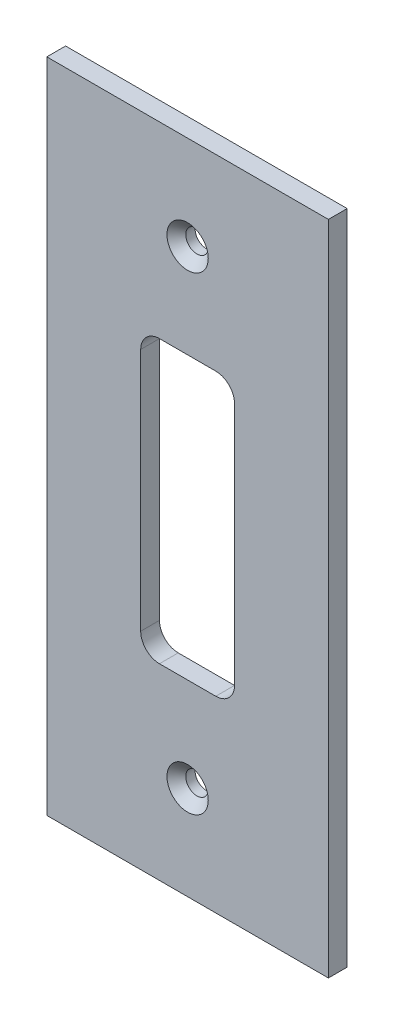
ISO-10303-21;
HEADER;
FILE_DESCRIPTION(('STEP AP214'),'2;1');
FILE_NAME('part.step','',(''),(''),'','','');
FILE_SCHEMA(('AUTOMOTIVE_DESIGN { 1 0 10303 214 1 1 1 1 }'));
ENDSEC;
DATA;
#1=APPLICATION_CONTEXT('core data for automotive mechanical design processes');
#2=APPLICATION_PROTOCOL_DEFINITION('international standard','automotive_design',2000,#1);
#3=PRODUCT_CONTEXT('',#1,'mechanical');
#4=PRODUCT('Part','Part','',(#3));
#5=PRODUCT_RELATED_PRODUCT_CATEGORY('part','',(#4));
#6=PRODUCT_DEFINITION_FORMATION('','',#4);
#7=PRODUCT_DEFINITION_CONTEXT('part definition',#1,'design');
#8=PRODUCT_DEFINITION('design','',#6,#7);
#9=PRODUCT_DEFINITION_SHAPE('','',#8);
#10=(LENGTH_UNIT() NAMED_UNIT(*) SI_UNIT(.MILLI.,.METRE.));
#11=(NAMED_UNIT(*) PLANE_ANGLE_UNIT() SI_UNIT($,.RADIAN.));
#12=(NAMED_UNIT(*) SI_UNIT($,.STERADIAN.) SOLID_ANGLE_UNIT());
#13=UNCERTAINTY_MEASURE_WITH_UNIT(LENGTH_MEASURE(1.E-05),#10,'distance_accuracy_value','');
#14=(GEOMETRIC_REPRESENTATION_CONTEXT(3) GLOBAL_UNCERTAINTY_ASSIGNED_CONTEXT((#13)) GLOBAL_UNIT_ASSIGNED_CONTEXT((#10,
#11,#12)) REPRESENTATION_CONTEXT('',''));
#15=CARTESIAN_POINT('',(0.,0.,0.));
#16=DIRECTION('',(0.,0.,1.));
#17=DIRECTION('',(1.,0.,0.));
#18=AXIS2_PLACEMENT_3D('',#15,#16,#17);
#19=CARTESIAN_POINT('',(0.,0.,-2.));
#20=DIRECTION('',(-1.,0.,0.));
#21=DIRECTION('',(0.,0.,1.));
#22=AXIS2_PLACEMENT_3D('',#19,#20,#21);
#23=PLANE('',#22);
#24=DIRECTION('',(0.,-1.,0.));
#25=VECTOR('',#24,1.);
#26=CARTESIAN_POINT('',(0.,0.,0.));
#27=LINE('',#26,#25);
#28=CARTESIAN_POINT('',(0.,70.,0.));
#29=VERTEX_POINT('',#28);
#30=CARTESIAN_POINT('',(0.,0.,0.));
#31=VERTEX_POINT('',#30);
#32=EDGE_CURVE('E187',#29,#31,#27,.T.);
#33=ORIENTED_EDGE('',*,*,#32,.F.);
#34=DIRECTION('',(0.,0.,1.));
#35=VECTOR('',#34,1.);
#36=CARTESIAN_POINT('',(0.,70.,-2.));
#37=LINE('',#36,#35);
#38=CARTESIAN_POINT('',(0.,70.,-2.));
#39=VERTEX_POINT('',#38);
#40=EDGE_CURVE('E11',#39,#29,#37,.T.);
#41=ORIENTED_EDGE('',*,*,#40,.F.);
#42=DIRECTION('',(0.,-1.,0.));
#43=VECTOR('',#42,1.);
#44=CARTESIAN_POINT('',(0.,0.,-2.));
#45=LINE('',#44,#43);
#46=CARTESIAN_POINT('',(0.,0.,-2.));
#47=VERTEX_POINT('',#46);
#48=EDGE_CURVE('E199',#39,#47,#45,.T.);
#49=ORIENTED_EDGE('',*,*,#48,.T.);
#50=DIRECTION('',(0.,0.,1.));
#51=VECTOR('',#50,1.);
#52=CARTESIAN_POINT('',(0.,0.,-2.));
#53=LINE('',#52,#51);
#54=EDGE_CURVE('E41',#47,#31,#53,.T.);
#55=ORIENTED_EDGE('',*,*,#54,.T.);
#56=EDGE_LOOP('',(#33,#41,#49,#55));
#57=FACE_BOUND('',#56,.T.);
#58=ADVANCED_FACE('F38',(#57),#23,.T.);
#59=CARTESIAN_POINT('',(0.,70.,-2.));
#60=DIRECTION('',(0.,1.,0.));
#61=DIRECTION('',(0.,0.,1.));
#62=AXIS2_PLACEMENT_3D('',#59,#60,#61);
#63=PLANE('',#62);
#64=DIRECTION('',(-1.,0.,0.));
#65=VECTOR('',#64,1.);
#66=CARTESIAN_POINT('',(0.,70.,0.));
#67=LINE('',#66,#65);
#68=CARTESIAN_POINT('',(30.,70.,0.));
#69=VERTEX_POINT('',#68);
#70=EDGE_CURVE('E203',#69,#29,#67,.T.);
#71=ORIENTED_EDGE('',*,*,#70,.F.);
#72=DIRECTION('',(0.,0.,1.));
#73=VECTOR('',#72,1.);
#74=CARTESIAN_POINT('',(30.,70.,-2.));
#75=LINE('',#74,#73);
#76=CARTESIAN_POINT('',(30.,70.,-2.));
#77=VERTEX_POINT('',#76);
#78=EDGE_CURVE('E46',#77,#69,#75,.T.);
#79=ORIENTED_EDGE('',*,*,#78,.F.);
#80=DIRECTION('',(-1.,0.,0.));
#81=VECTOR('',#80,1.);
#82=CARTESIAN_POINT('',(0.,70.,-2.));
#83=LINE('',#82,#81);
#84=EDGE_CURVE('E209',#77,#39,#83,.T.);
#85=ORIENTED_EDGE('',*,*,#84,.T.);
#86=ORIENTED_EDGE('',*,*,#40,.T.);
#87=EDGE_LOOP('',(#71,#79,#85,#86));
#88=FACE_BOUND('',#87,.T.);
#89=ADVANCED_FACE('F235',(#88),#63,.T.);
#90=CARTESIAN_POINT('',(30.,0.,-2.));
#91=DIRECTION('',(1.,0.,0.));
#92=DIRECTION('',(0.,0.,-1.));
#93=AXIS2_PLACEMENT_3D('',#90,#91,#92);
#94=PLANE('',#93);
#95=DIRECTION('',(0.,1.,0.));
#96=VECTOR('',#95,1.);
#97=CARTESIAN_POINT('',(30.,0.,0.));
#98=LINE('',#97,#96);
#99=CARTESIAN_POINT('',(30.,0.,0.));
#100=VERTEX_POINT('',#99);
#101=EDGE_CURVE('E217',#100,#69,#98,.T.);
#102=ORIENTED_EDGE('',*,*,#101,.F.);
#103=DIRECTION('',(0.,0.,1.));
#104=VECTOR('',#103,1.);
#105=CARTESIAN_POINT('',(30.,0.,-2.));
#106=LINE('',#105,#104);
#107=CARTESIAN_POINT('',(30.,0.,-2.));
#108=VERTEX_POINT('',#107);
#109=EDGE_CURVE('E222',#108,#100,#106,.T.);
#110=ORIENTED_EDGE('',*,*,#109,.F.);
#111=DIRECTION('',(0.,1.,0.));
#112=VECTOR('',#111,1.);
#113=CARTESIAN_POINT('',(30.,0.,-2.));
#114=LINE('',#113,#112);
#115=EDGE_CURVE('E206',#108,#77,#114,.T.);
#116=ORIENTED_EDGE('',*,*,#115,.T.);
#117=ORIENTED_EDGE('',*,*,#78,.T.);
#118=EDGE_LOOP('',(#102,#110,#116,#117));
#119=FACE_BOUND('',#118,.T.);
#120=ADVANCED_FACE('F239',(#119),#94,.T.);
#121=CARTESIAN_POINT('',(0.,0.,-2.));
#122=DIRECTION('',(0.,-1.,0.));
#123=DIRECTION('',(0.,0.,-1.));
#124=AXIS2_PLACEMENT_3D('',#121,#122,#123);
#125=PLANE('',#124);
#126=DIRECTION('',(1.,0.,0.));
#127=VECTOR('',#126,1.);
#128=CARTESIAN_POINT('',(0.,0.,0.));
#129=LINE('',#128,#127);
#130=EDGE_CURVE('E214',#31,#100,#129,.T.);
#131=ORIENTED_EDGE('',*,*,#130,.F.);
#132=ORIENTED_EDGE('',*,*,#54,.F.);
#133=DIRECTION('',(1.,0.,0.));
#134=VECTOR('',#133,1.);
#135=CARTESIAN_POINT('',(0.,0.,-2.));
#136=LINE('',#135,#134);
#137=EDGE_CURVE('E202',#47,#108,#136,.T.);
#138=ORIENTED_EDGE('',*,*,#137,.T.);
#139=ORIENTED_EDGE('',*,*,#109,.T.);
#140=EDGE_LOOP('',(#131,#132,#138,#139));
#141=FACE_BOUND('',#140,.T.);
#142=ADVANCED_FACE('F230',(#141),#125,.T.);
#143=CARTESIAN_POINT('',(0.,70.,-2.));
#144=DIRECTION('',(0.,0.,-1.));
#145=DIRECTION('',(-1.,0.,0.));
#146=AXIS2_PLACEMENT_3D('',#143,#144,#145);
#147=PLANE('',#146);
#148=CARTESIAN_POINT('',(15.,60.,-2.));
#149=DIRECTION('',(0.,0.,1.));
#150=DIRECTION('',(1.,0.,0.));
#151=AXIS2_PLACEMENT_3D('',#148,#149,#150);
#152=CIRCLE('',#151,1.2);
#153=CARTESIAN_POINT('',(16.2,60.,-2.));
#154=VERTEX_POINT('',#153);
#155=EDGE_CURVE('E409',#154,#154,#152,.T.);
#156=ORIENTED_EDGE('',*,*,#155,.T.);
#157=EDGE_LOOP('',(#156));
#158=FACE_BOUND('',#157,.T.);
#159=CARTESIAN_POINT('',(15.,10.,-2.));
#160=DIRECTION('',(0.,0.,1.));
#161=DIRECTION('',(1.,0.,0.));
#162=AXIS2_PLACEMENT_3D('',#159,#160,#161);
#163=CIRCLE('',#162,1.2);
#164=CARTESIAN_POINT('',(16.2,10.,-2.));
#165=VERTEX_POINT('',#164);
#166=EDGE_CURVE('E152',#165,#165,#163,.T.);
#167=ORIENTED_EDGE('',*,*,#166,.T.);
#168=EDGE_LOOP('',(#167));
#169=FACE_BOUND('',#168,.T.);
#170=CARTESIAN_POINT('',(12.,48.,-2.));
#171=DIRECTION('',(0.,0.,1.));
#172=DIRECTION('',(1.,0.,0.));
#173=AXIS2_PLACEMENT_3D('',#170,#171,#172);
#174=CIRCLE('',#173,2.);
#175=CARTESIAN_POINT('',(12.,50.,-2.));
#176=VERTEX_POINT('',#175);
#177=CARTESIAN_POINT('',(10.,48.,-2.));
#178=VERTEX_POINT('',#177);
#179=EDGE_CURVE('E129',#176,#178,#174,.T.);
#180=ORIENTED_EDGE('',*,*,#179,.T.);
#181=DIRECTION('',(0.,-1.,0.));
#182=VECTOR('',#181,1.);
#183=CARTESIAN_POINT('',(10.,48.,-2.));
#184=LINE('',#183,#182);
#185=CARTESIAN_POINT('',(10.,22.,-2.));
#186=VERTEX_POINT('',#185);
#187=EDGE_CURVE('E138',#178,#186,#184,.T.);
#188=ORIENTED_EDGE('',*,*,#187,.T.);
#189=CARTESIAN_POINT('',(12.,22.,-2.));
#190=DIRECTION('',(0.,0.,1.));
#191=DIRECTION('',(1.,0.,0.));
#192=AXIS2_PLACEMENT_3D('',#189,#190,#191);
#193=CIRCLE('',#192,2.);
#194=CARTESIAN_POINT('',(12.,20.,-2.));
#195=VERTEX_POINT('',#194);
#196=EDGE_CURVE('E54',#186,#195,#193,.T.);
#197=ORIENTED_EDGE('',*,*,#196,.T.);
#198=DIRECTION('',(1.,0.,0.));
#199=VECTOR('',#198,1.);
#200=CARTESIAN_POINT('',(12.,20.,-2.));
#201=LINE('',#200,#199);
#202=CARTESIAN_POINT('',(18.,20.,-2.));
#203=VERTEX_POINT('',#202);
#204=EDGE_CURVE('E156',#195,#203,#201,.T.);
#205=ORIENTED_EDGE('',*,*,#204,.T.);
#206=CARTESIAN_POINT('',(18.,22.,-2.));
#207=DIRECTION('',(0.,0.,1.));
#208=DIRECTION('',(1.,0.,0.));
#209=AXIS2_PLACEMENT_3D('',#206,#207,#208);
#210=CIRCLE('',#209,2.);
#211=CARTESIAN_POINT('',(20.,22.,-2.));
#212=VERTEX_POINT('',#211);
#213=EDGE_CURVE('E159',#203,#212,#210,.T.);
#214=ORIENTED_EDGE('',*,*,#213,.T.);
#215=DIRECTION('',(0.,1.,0.));
#216=VECTOR('',#215,1.);
#217=CARTESIAN_POINT('',(20.,48.,-2.));
#218=LINE('',#217,#216);
#219=CARTESIAN_POINT('',(20.,48.,-2.));
#220=VERTEX_POINT('',#219);
#221=EDGE_CURVE('E162',#212,#220,#218,.T.);
#222=ORIENTED_EDGE('',*,*,#221,.T.);
#223=CARTESIAN_POINT('',(18.,48.,-2.));
#224=DIRECTION('',(0.,0.,1.));
#225=DIRECTION('',(-1.,0.,0.));
#226=AXIS2_PLACEMENT_3D('',#223,#224,#225);
#227=CIRCLE('',#226,2.);
#228=CARTESIAN_POINT('',(18.,50.,-2.));
#229=VERTEX_POINT('',#228);
#230=EDGE_CURVE('E165',#220,#229,#227,.T.);
#231=ORIENTED_EDGE('',*,*,#230,.T.);
#232=DIRECTION('',(-1.,0.,0.));
#233=VECTOR('',#232,1.);
#234=CARTESIAN_POINT('',(12.,50.,-2.));
#235=LINE('',#234,#233);
#236=EDGE_CURVE('E135',#229,#176,#235,.T.);
#237=ORIENTED_EDGE('',*,*,#236,.T.);
#238=EDGE_LOOP('',(#180,#188,#197,#205,#214,#222,#231,#237));
#239=FACE_BOUND('',#238,.T.);
#240=ORIENTED_EDGE('',*,*,#48,.F.);
#241=ORIENTED_EDGE('',*,*,#84,.F.);
#242=ORIENTED_EDGE('',*,*,#115,.F.);
#243=ORIENTED_EDGE('',*,*,#137,.F.);
#244=EDGE_LOOP('',(#240,#241,#242,#243));
#245=FACE_BOUND('',#244,.T.);
#246=ADVANCED_FACE('F142',(#158,#169,#239,#245),#147,.T.);
#247=CARTESIAN_POINT('',(0.,70.,0.));
#248=DIRECTION('',(0.,0.,-1.));
#249=DIRECTION('',(-1.,0.,0.));
#250=AXIS2_PLACEMENT_3D('',#247,#248,#249);
#251=PLANE('',#250);
#252=CARTESIAN_POINT('',(15.,60.,0.));
#253=DIRECTION('',(0.,0.,1.));
#254=DIRECTION('',(1.,0.,0.));
#255=AXIS2_PLACEMENT_3D('',#252,#253,#254);
#256=CIRCLE('',#255,2.2);
#257=CARTESIAN_POINT('',(17.2,60.,0.));
#258=VERTEX_POINT('',#257);
#259=EDGE_CURVE('E407',#258,#258,#256,.T.);
#260=ORIENTED_EDGE('',*,*,#259,.F.);
#261=EDGE_LOOP('',(#260));
#262=FACE_BOUND('',#261,.T.);
#263=CARTESIAN_POINT('',(15.,10.,0.));
#264=DIRECTION('',(0.,0.,1.));
#265=DIRECTION('',(1.,0.,0.));
#266=AXIS2_PLACEMENT_3D('',#263,#264,#265);
#267=CIRCLE('',#266,2.2);
#268=CARTESIAN_POINT('',(17.2,10.,0.));
#269=VERTEX_POINT('',#268);
#270=EDGE_CURVE('E414',#269,#269,#267,.T.);
#271=ORIENTED_EDGE('',*,*,#270,.F.);
#272=EDGE_LOOP('',(#271));
#273=FACE_BOUND('',#272,.T.);
#274=DIRECTION('',(0.,-1.,0.));
#275=VECTOR('',#274,1.);
#276=CARTESIAN_POINT('',(10.,48.,0.));
#277=LINE('',#276,#275);
#278=CARTESIAN_POINT('',(10.,48.,0.));
#279=VERTEX_POINT('',#278);
#280=CARTESIAN_POINT('',(10.,22.,0.));
#281=VERTEX_POINT('',#280);
#282=EDGE_CURVE('E169',#279,#281,#277,.T.);
#283=ORIENTED_EDGE('',*,*,#282,.F.);
#284=CARTESIAN_POINT('',(12.,48.,0.));
#285=DIRECTION('',(0.,0.,1.));
#286=DIRECTION('',(1.,0.,0.));
#287=AXIS2_PLACEMENT_3D('',#284,#285,#286);
#288=CIRCLE('',#287,2.);
#289=CARTESIAN_POINT('',(12.,50.,0.));
#290=VERTEX_POINT('',#289);
#291=EDGE_CURVE('E62',#290,#279,#288,.T.);
#292=ORIENTED_EDGE('',*,*,#291,.F.);
#293=DIRECTION('',(-1.,0.,0.));
#294=VECTOR('',#293,1.);
#295=CARTESIAN_POINT('',(12.,50.,0.));
#296=LINE('',#295,#294);
#297=CARTESIAN_POINT('',(18.,50.,0.));
#298=VERTEX_POINT('',#297);
#299=EDGE_CURVE('E146',#298,#290,#296,.T.);
#300=ORIENTED_EDGE('',*,*,#299,.F.);
#301=CARTESIAN_POINT('',(18.,48.,0.));
#302=DIRECTION('',(0.,0.,1.));
#303=DIRECTION('',(-1.,0.,0.));
#304=AXIS2_PLACEMENT_3D('',#301,#302,#303);
#305=CIRCLE('',#304,2.);
#306=CARTESIAN_POINT('',(20.,48.,0.));
#307=VERTEX_POINT('',#306);
#308=EDGE_CURVE('E149',#307,#298,#305,.T.);
#309=ORIENTED_EDGE('',*,*,#308,.F.);
#310=DIRECTION('',(0.,1.,0.));
#311=VECTOR('',#310,1.);
#312=CARTESIAN_POINT('',(20.,48.,0.));
#313=LINE('',#312,#311);
#314=CARTESIAN_POINT('',(20.,22.,0.));
#315=VERTEX_POINT('',#314);
#316=EDGE_CURVE('E180',#315,#307,#313,.T.);
#317=ORIENTED_EDGE('',*,*,#316,.F.);
#318=CARTESIAN_POINT('',(18.,22.,0.));
#319=DIRECTION('',(0.,0.,1.));
#320=DIRECTION('',(1.,0.,0.));
#321=AXIS2_PLACEMENT_3D('',#318,#319,#320);
#322=CIRCLE('',#321,2.);
#323=CARTESIAN_POINT('',(18.,20.,0.));
#324=VERTEX_POINT('',#323);
#325=EDGE_CURVE('E177',#324,#315,#322,.T.);
#326=ORIENTED_EDGE('',*,*,#325,.F.);
#327=DIRECTION('',(1.,0.,0.));
#328=VECTOR('',#327,1.);
#329=CARTESIAN_POINT('',(12.,20.,0.));
#330=LINE('',#329,#328);
#331=CARTESIAN_POINT('',(12.,20.,0.));
#332=VERTEX_POINT('',#331);
#333=EDGE_CURVE('E174',#332,#324,#330,.T.);
#334=ORIENTED_EDGE('',*,*,#333,.F.);
#335=CARTESIAN_POINT('',(12.,22.,0.));
#336=DIRECTION('',(0.,0.,1.));
#337=DIRECTION('',(1.,0.,0.));
#338=AXIS2_PLACEMENT_3D('',#335,#336,#337);
#339=CIRCLE('',#338,2.);
#340=EDGE_CURVE('E171',#281,#332,#339,.T.);
#341=ORIENTED_EDGE('',*,*,#340,.F.);
#342=EDGE_LOOP('',(#283,#292,#300,#309,#317,#326,#334,#341));
#343=FACE_BOUND('',#342,.T.);
#344=ORIENTED_EDGE('',*,*,#32,.T.);
#345=ORIENTED_EDGE('',*,*,#130,.T.);
#346=ORIENTED_EDGE('',*,*,#101,.T.);
#347=ORIENTED_EDGE('',*,*,#70,.T.);
#348=EDGE_LOOP('',(#344,#345,#346,#347));
#349=FACE_BOUND('',#348,.T.);
#350=ADVANCED_FACE('F232',(#262,#273,#343,#349),#251,.F.);
#351=CARTESIAN_POINT('',(12.,48.,-2.));
#352=DIRECTION('',(0.,0.,1.));
#353=DIRECTION('',(1.,0.,0.));
#354=AXIS2_PLACEMENT_3D('',#351,#352,#353);
#355=CYLINDRICAL_SURFACE('',#354,2.);
#356=ORIENTED_EDGE('',*,*,#291,.T.);
#357=DIRECTION('',(0.,0.,1.));
#358=VECTOR('',#357,1.);
#359=CARTESIAN_POINT('',(10.,48.,-2.));
#360=LINE('',#359,#358);
#361=EDGE_CURVE('E125',#178,#279,#360,.T.);
#362=ORIENTED_EDGE('',*,*,#361,.F.);
#363=ORIENTED_EDGE('',*,*,#179,.F.);
#364=DIRECTION('',(0.,0.,1.));
#365=VECTOR('',#364,1.);
#366=CARTESIAN_POINT('',(12.,50.,-2.));
#367=LINE('',#366,#365);
#368=EDGE_CURVE('E185',#176,#290,#367,.T.);
#369=ORIENTED_EDGE('',*,*,#368,.T.);
#370=EDGE_LOOP('',(#356,#362,#363,#369));
#371=FACE_BOUND('',#370,.T.);
#372=ADVANCED_FACE('F127',(#371),#355,.F.);
#373=CARTESIAN_POINT('',(12.,50.,-2.));
#374=DIRECTION('',(0.,1.,0.));
#375=DIRECTION('',(0.,0.,1.));
#376=AXIS2_PLACEMENT_3D('',#373,#374,#375);
#377=PLANE('',#376);
#378=ORIENTED_EDGE('',*,*,#299,.T.);
#379=ORIENTED_EDGE('',*,*,#368,.F.);
#380=ORIENTED_EDGE('',*,*,#236,.F.);
#381=DIRECTION('',(0.,0.,1.));
#382=VECTOR('',#381,1.);
#383=CARTESIAN_POINT('',(18.,50.,-2.));
#384=LINE('',#383,#382);
#385=EDGE_CURVE('E188',#229,#298,#384,.T.);
#386=ORIENTED_EDGE('',*,*,#385,.T.);
#387=EDGE_LOOP('',(#378,#379,#380,#386));
#388=FACE_BOUND('',#387,.T.);
#389=ADVANCED_FACE('F275',(#388),#377,.F.);
#390=CARTESIAN_POINT('',(18.,48.,-2.));
#391=DIRECTION('',(0.,0.,1.));
#392=DIRECTION('',(1.,0.,0.));
#393=AXIS2_PLACEMENT_3D('',#390,#391,#392);
#394=CYLINDRICAL_SURFACE('',#393,2.);
#395=ORIENTED_EDGE('',*,*,#308,.T.);
#396=ORIENTED_EDGE('',*,*,#385,.F.);
#397=ORIENTED_EDGE('',*,*,#230,.F.);
#398=DIRECTION('',(0.,0.,1.));
#399=VECTOR('',#398,1.);
#400=CARTESIAN_POINT('',(20.,48.,-2.));
#401=LINE('',#400,#399);
#402=EDGE_CURVE('E190',#220,#307,#401,.T.);
#403=ORIENTED_EDGE('',*,*,#402,.T.);
#404=EDGE_LOOP('',(#395,#396,#397,#403));
#405=FACE_BOUND('',#404,.T.);
#406=ADVANCED_FACE('F286',(#405),#394,.F.);
#407=CARTESIAN_POINT('',(20.,48.,-2.));
#408=DIRECTION('',(1.,0.,0.));
#409=DIRECTION('',(0.,0.,-1.));
#410=AXIS2_PLACEMENT_3D('',#407,#408,#409);
#411=PLANE('',#410);
#412=ORIENTED_EDGE('',*,*,#316,.T.);
#413=ORIENTED_EDGE('',*,*,#402,.F.);
#414=ORIENTED_EDGE('',*,*,#221,.F.);
#415=DIRECTION('',(0.,0.,1.));
#416=VECTOR('',#415,1.);
#417=CARTESIAN_POINT('',(20.,22.,-2.));
#418=LINE('',#417,#416);
#419=EDGE_CURVE('E192',#212,#315,#418,.T.);
#420=ORIENTED_EDGE('',*,*,#419,.T.);
#421=EDGE_LOOP('',(#412,#413,#414,#420));
#422=FACE_BOUND('',#421,.T.);
#423=ADVANCED_FACE('F296',(#422),#411,.F.);
#424=CARTESIAN_POINT('',(18.,22.,-2.));
#425=DIRECTION('',(0.,0.,1.));
#426=DIRECTION('',(1.,0.,0.));
#427=AXIS2_PLACEMENT_3D('',#424,#425,#426);
#428=CYLINDRICAL_SURFACE('',#427,2.);
#429=ORIENTED_EDGE('',*,*,#325,.T.);
#430=ORIENTED_EDGE('',*,*,#419,.F.);
#431=ORIENTED_EDGE('',*,*,#213,.F.);
#432=DIRECTION('',(0.,0.,1.));
#433=VECTOR('',#432,1.);
#434=CARTESIAN_POINT('',(18.,20.,-2.));
#435=LINE('',#434,#433);
#436=EDGE_CURVE('E194',#203,#324,#435,.T.);
#437=ORIENTED_EDGE('',*,*,#436,.T.);
#438=EDGE_LOOP('',(#429,#430,#431,#437));
#439=FACE_BOUND('',#438,.T.);
#440=ADVANCED_FACE('F306',(#439),#428,.F.);
#441=CARTESIAN_POINT('',(12.,20.,-2.));
#442=DIRECTION('',(0.,-1.,0.));
#443=DIRECTION('',(0.,0.,-1.));
#444=AXIS2_PLACEMENT_3D('',#441,#442,#443);
#445=PLANE('',#444);
#446=ORIENTED_EDGE('',*,*,#333,.T.);
#447=ORIENTED_EDGE('',*,*,#436,.F.);
#448=ORIENTED_EDGE('',*,*,#204,.F.);
#449=DIRECTION('',(0.,0.,1.));
#450=VECTOR('',#449,1.);
#451=CARTESIAN_POINT('',(12.,20.,-2.));
#452=LINE('',#451,#450);
#453=EDGE_CURVE('E196',#195,#332,#452,.T.);
#454=ORIENTED_EDGE('',*,*,#453,.T.);
#455=EDGE_LOOP('',(#446,#447,#448,#454));
#456=FACE_BOUND('',#455,.T.);
#457=ADVANCED_FACE('F316',(#456),#445,.F.);
#458=CARTESIAN_POINT('',(12.,22.,-2.));
#459=DIRECTION('',(0.,0.,1.));
#460=DIRECTION('',(1.,0.,0.));
#461=AXIS2_PLACEMENT_3D('',#458,#459,#460);
#462=CYLINDRICAL_SURFACE('',#461,2.);
#463=ORIENTED_EDGE('',*,*,#340,.T.);
#464=ORIENTED_EDGE('',*,*,#453,.F.);
#465=ORIENTED_EDGE('',*,*,#196,.F.);
#466=DIRECTION('',(0.,0.,1.));
#467=VECTOR('',#466,1.);
#468=CARTESIAN_POINT('',(10.,22.,-2.));
#469=LINE('',#468,#467);
#470=EDGE_CURVE('E134',#186,#281,#469,.T.);
#471=ORIENTED_EDGE('',*,*,#470,.T.);
#472=EDGE_LOOP('',(#463,#464,#465,#471));
#473=FACE_BOUND('',#472,.T.);
#474=ADVANCED_FACE('F326',(#473),#462,.F.);
#475=CARTESIAN_POINT('',(10.,48.,-2.));
#476=DIRECTION('',(-1.,0.,0.));
#477=DIRECTION('',(0.,0.,1.));
#478=AXIS2_PLACEMENT_3D('',#475,#476,#477);
#479=PLANE('',#478);
#480=ORIENTED_EDGE('',*,*,#282,.T.);
#481=ORIENTED_EDGE('',*,*,#470,.F.);
#482=ORIENTED_EDGE('',*,*,#187,.F.);
#483=ORIENTED_EDGE('',*,*,#361,.T.);
#484=EDGE_LOOP('',(#480,#481,#482,#483));
#485=FACE_BOUND('',#484,.T.);
#486=ADVANCED_FACE('F139',(#485),#479,.F.);
#487=CARTESIAN_POINT('',(15.,10.,0.));
#488=DIRECTION('',(0.,0.,1.));
#489=DIRECTION('',(1.,0.,0.));
#490=AXIS2_PLACEMENT_3D('',#487,#488,#489);
#491=CYLINDRICAL_SURFACE('',#490,1.19999999999999);
#492=ORIENTED_EDGE('',*,*,#166,.F.);
#493=EDGE_LOOP('',(#492));
#494=FACE_BOUND('',#493,.T.);
#495=CARTESIAN_POINT('',(15.,10.,-1.));
#496=DIRECTION('',(0.,0.,1.));
#497=DIRECTION('',(1.,0.,0.));
#498=AXIS2_PLACEMENT_3D('',#495,#496,#497);
#499=CIRCLE('',#498,1.19999999999999);
#500=CARTESIAN_POINT('',(16.2,10.,-1.));
#501=VERTEX_POINT('',#500);
#502=EDGE_CURVE('E416',#501,#501,#499,.T.);
#503=ORIENTED_EDGE('',*,*,#502,.T.);
#504=EDGE_LOOP('',(#503));
#505=FACE_BOUND('',#504,.T.);
#506=ADVANCED_FACE('F344',(#494,#505),#491,.F.);
#507=CARTESIAN_POINT('',(15.,10.,0.));
#508=DIRECTION('',(0.,0.,1.));
#509=DIRECTION('',(1.,0.,0.));
#510=AXIS2_PLACEMENT_3D('',#507,#508,#509);
#511=CONICAL_SURFACE('',#510,2.2,0.785398163397454);
#512=ORIENTED_EDGE('',*,*,#502,.F.);
#513=EDGE_LOOP('',(#512));
#514=FACE_BOUND('',#513,.T.);
#515=ORIENTED_EDGE('',*,*,#270,.T.);
#516=EDGE_LOOP('',(#515));
#517=FACE_BOUND('',#516,.T.);
#518=ADVANCED_FACE('F367',(#514,#517),#511,.F.);
#519=CARTESIAN_POINT('',(15.,60.,0.));
#520=DIRECTION('',(0.,0.,1.));
#521=DIRECTION('',(1.,0.,0.));
#522=AXIS2_PLACEMENT_3D('',#519,#520,#521);
#523=CYLINDRICAL_SURFACE('',#522,1.19999999999999);
#524=ORIENTED_EDGE('',*,*,#155,.F.);
#525=EDGE_LOOP('',(#524));
#526=FACE_BOUND('',#525,.T.);
#527=CARTESIAN_POINT('',(15.,60.,-1.));
#528=DIRECTION('',(0.,0.,1.));
#529=DIRECTION('',(1.,0.,0.));
#530=AXIS2_PLACEMENT_3D('',#527,#528,#529);
#531=CIRCLE('',#530,1.19999999999999);
#532=CARTESIAN_POINT('',(16.2,60.,-1.));
#533=VERTEX_POINT('',#532);
#534=EDGE_CURVE('E404',#533,#533,#531,.T.);
#535=ORIENTED_EDGE('',*,*,#534,.T.);
#536=EDGE_LOOP('',(#535));
#537=FACE_BOUND('',#536,.T.);
#538=ADVANCED_FACE('F377',(#526,#537),#523,.F.);
#539=CARTESIAN_POINT('',(15.,60.,0.));
#540=DIRECTION('',(0.,0.,1.));
#541=DIRECTION('',(1.,0.,0.));
#542=AXIS2_PLACEMENT_3D('',#539,#540,#541);
#543=CONICAL_SURFACE('',#542,2.2,0.785398163397454);
#544=ORIENTED_EDGE('',*,*,#534,.F.);
#545=EDGE_LOOP('',(#544));
#546=FACE_BOUND('',#545,.T.);
#547=ORIENTED_EDGE('',*,*,#259,.T.);
#548=EDGE_LOOP('',(#547));
#549=FACE_BOUND('',#548,.T.);
#550=ADVANCED_FACE('F387',(#546,#549),#543,.F.);
#551=CLOSED_SHELL('',(#58,#89,#120,#142,#246,#350,#372,#389,#406,#423,#440,#457,#474,#486,#506,
#518,#538,#550));
#552=MANIFOLD_SOLID_BREP('B2',#551);
#553=ADVANCED_BREP_SHAPE_REPRESENTATION('',(#18,#552),#14);
#554=SHAPE_DEFINITION_REPRESENTATION(#9,#553);
ENDSEC;
END-ISO-10303-21;
